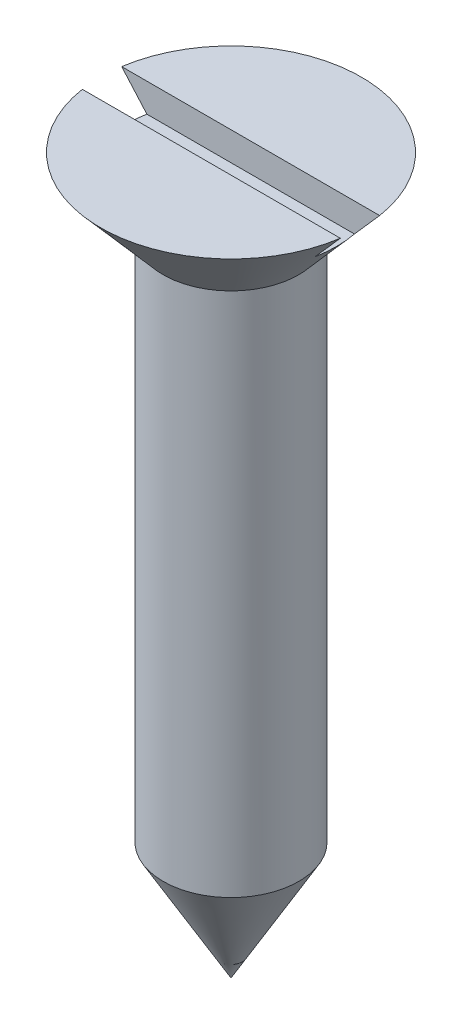
ISO-10303-21;
HEADER;
FILE_DESCRIPTION(('STEP AP214'),'2;1');
FILE_NAME('part.step','',(''),(''),'','','');
FILE_SCHEMA(('AUTOMOTIVE_DESIGN { 1 0 10303 214 1 1 1 1 }'));
ENDSEC;
DATA;
#1=APPLICATION_CONTEXT('core data for automotive mechanical design processes');
#2=APPLICATION_PROTOCOL_DEFINITION('international standard','automotive_design',2000,#1);
#3=PRODUCT_CONTEXT('',#1,'mechanical');
#4=PRODUCT('Part','Part','',(#3));
#5=PRODUCT_RELATED_PRODUCT_CATEGORY('part','',(#4));
#6=PRODUCT_DEFINITION_FORMATION('','',#4);
#7=PRODUCT_DEFINITION_CONTEXT('part definition',#1,'design');
#8=PRODUCT_DEFINITION('design','',#6,#7);
#9=PRODUCT_DEFINITION_SHAPE('','',#8);
#10=(LENGTH_UNIT() NAMED_UNIT(*) SI_UNIT(.MILLI.,.METRE.));
#11=(NAMED_UNIT(*) PLANE_ANGLE_UNIT() SI_UNIT($,.RADIAN.));
#12=(NAMED_UNIT(*) SI_UNIT($,.STERADIAN.) SOLID_ANGLE_UNIT());
#13=UNCERTAINTY_MEASURE_WITH_UNIT(LENGTH_MEASURE(1.E-05),#10,'distance_accuracy_value','');
#14=(GEOMETRIC_REPRESENTATION_CONTEXT(3) GLOBAL_UNCERTAINTY_ASSIGNED_CONTEXT((#13)) GLOBAL_UNIT_ASSIGNED_CONTEXT((#10,
#11,#12)) REPRESENTATION_CONTEXT('',''));
#15=CARTESIAN_POINT('',(0.,0.,0.));
#16=DIRECTION('',(0.,0.,1.));
#17=DIRECTION('',(1.,0.,0.));
#18=AXIS2_PLACEMENT_3D('',#15,#16,#17);
#19=CARTESIAN_POINT('',(0.,25.4,0.));
#20=DIRECTION('',(0.,1.,0.));
#21=DIRECTION('',(0.,0.,1.));
#22=AXIS2_PLACEMENT_3D('',#19,#20,#21);
#23=PLANE('',#22);
#24=DIRECTION('',(1.,0.,0.));
#25=VECTOR('',#24,1.);
#26=CARTESIAN_POINT('',(0.,25.4,0.6985));
#27=LINE('',#26,#25);
#28=CARTESIAN_POINT('',(-4.58257111237785,25.4,0.6985));
#29=VERTEX_POINT('',#28);
#30=CARTESIAN_POINT('',(4.58257111237785,25.4,0.6985));
#31=VERTEX_POINT('',#30);
#32=EDGE_CURVE('E94',#29,#31,#27,.T.);
#33=ORIENTED_EDGE('',*,*,#32,.F.);
#34=CARTESIAN_POINT('',(0.,25.4,0.));
#35=DIRECTION('',(0.,-1.,0.));
#36=DIRECTION('',(1.,0.,0.));
#37=AXIS2_PLACEMENT_3D('',#34,#35,#36);
#38=CIRCLE('',#37,4.6355);
#39=EDGE_CURVE('E108',#31,#29,#38,.T.);
#40=ORIENTED_EDGE('',*,*,#39,.F.);
#41=EDGE_LOOP('',(#33,#40));
#42=FACE_BOUND('',#41,.T.);
#43=ADVANCED_FACE('F46',(#42),#23,.T.);
#44=CARTESIAN_POINT('',(0.,25.4,0.));
#45=DIRECTION('',(0.,-1.,0.));
#46=DIRECTION('',(0.,0.,-1.));
#47=AXIS2_PLACEMENT_3D('',#44,#45,#46);
#48=CYLINDRICAL_SURFACE('',#47,2.413);
#49=CARTESIAN_POINT('',(0.,22.8433062149513,0.));
#50=DIRECTION('',(0.,1.,0.));
#51=DIRECTION('',(-1.,0.,0.));
#52=AXIS2_PLACEMENT_3D('',#49,#50,#51);
#53=CIRCLE('',#52,2.413);
#54=CARTESIAN_POINT('',(-2.413,22.8433062149513,0.));
#55=VERTEX_POINT('',#54);
#56=EDGE_CURVE('E95',#55,#55,#53,.F.);
#57=ORIENTED_EDGE('',*,*,#56,.T.);
#58=EDGE_LOOP('',(#57));
#59=FACE_BOUND('',#58,.T.);
#60=CARTESIAN_POINT('',(0.,4.17943859866376,0.));
#61=DIRECTION('',(0.,1.,0.));
#62=DIRECTION('',(0.,0.,1.));
#63=AXIS2_PLACEMENT_3D('',#60,#61,#62);
#64=CIRCLE('',#63,2.413);
#65=CARTESIAN_POINT('',(0.,4.17943859866376,2.413));
#66=VERTEX_POINT('',#65);
#67=EDGE_CURVE('E109',#66,#66,#64,.T.);
#68=ORIENTED_EDGE('',*,*,#67,.T.);
#69=EDGE_LOOP('',(#68));
#70=FACE_BOUND('',#69,.T.);
#71=ADVANCED_FACE('F48',(#59,#70),#48,.T.);
#72=CARTESIAN_POINT('',(0.,20.0674672483269,0.));
#73=DIRECTION('',(0.,1.,0.));
#74=DIRECTION('',(-1.,0.,0.));
#75=AXIS2_PLACEMENT_3D('',#72,#73,#74);
#76=CONICAL_SURFACE('',#75,0.,0.715584993317669);
#77=CARTESIAN_POINT('',(12.7239228215762,34.7267050796105,0.6985));
#78=CARTESIAN_POINT('',(12.3001572509421,34.2399567929915,0.6985));
#79=CARTESIAN_POINT('',(11.8763604578222,33.7532356733004,0.6985));
#80=CARTESIAN_POINT('',(11.028664891162,32.7798790859785,0.6985));
#81=CARTESIAN_POINT('',(10.6047661172503,32.2932436186712,0.6985));
#82=CARTESIAN_POINT('',(9.75675302797358,31.3200047015358,0.6985));
#83=CARTESIAN_POINT('',(9.33263868742159,30.8334012736527,0.6985));
#84=CARTESIAN_POINT('',(8.48420562839707,29.8603756240636,0.6985));
#85=CARTESIAN_POINT('',(8.05988691065418,29.3739534017216,0.6985));
#86=CARTESIAN_POINT('',(7.2164398972194,28.4077138051512,0.6985));
#87=CARTESIAN_POINT('',(6.79731581568072,27.9278927523368,0.6985));
#88=CARTESIAN_POINT('',(5.95853426298975,26.9687079309938,0.6985));
#89=CARTESIAN_POINT('',(5.53887678636059,26.4893441672504,0.6985));
#90=CARTESIAN_POINT('',(4.90864472636623,25.7710111396983,0.6985));
#91=CARTESIAN_POINT('',(4.69845756911359,25.5317020261792,0.6985));
#92=CARTESIAN_POINT('',(4.27769572212292,25.0534248115906,0.6985));
#93=CARTESIAN_POINT('',(4.06712103270087,24.8144567102434,0.6985));
#94=CARTESIAN_POINT('',(3.64537119919808,24.337058128522,0.6985));
#95=CARTESIAN_POINT('',(3.43419606529339,24.098627639158,0.6985));
#96=CARTESIAN_POINT('',(3.01084873187954,23.6226538951711,0.6985));
#97=CARTESIAN_POINT('',(2.79867654000073,23.3851106337833,0.6985));
#98=CARTESIAN_POINT('',(2.52960029103581,23.0862972349534,0.6985));
#99=CARTESIAN_POINT('',(2.47358661504908,23.0242256625782,0.6985));
#100=CARTESIAN_POINT('',(2.36139296082815,22.9002327427108,0.6985));
#101=CARTESIAN_POINT('',(2.3052129822708,22.8383113955107,0.6985));
#102=CARTESIAN_POINT('',(2.13635225908666,22.6527988956865,0.6985));
#103=CARTESIAN_POINT('',(2.02337060257298,22.5294814069046,0.6985));
#104=CARTESIAN_POINT('',(1.79574198127609,22.2835404232173,0.6985));
#105=CARTESIAN_POINT('',(1.68109041146271,22.1609211651908,0.6985));
#106=CARTESIAN_POINT('',(1.50750068681165,21.9785742781316,0.6985));
#107=CARTESIAN_POINT('',(1.44938125202166,21.9180683523884,0.6985));
#108=CARTESIAN_POINT('',(1.33238722051913,21.7977922352813,0.6985));
#109=CARTESIAN_POINT('',(1.27351264915804,21.7380220193495,0.6985));
#110=CARTESIAN_POINT('',(1.15488046951291,21.6197311388378,0.6985));
#111=CARTESIAN_POINT('',(1.09512614368296,21.5612071896787,0.6985));
#112=CARTESIAN_POINT('',(0.973994870008162,21.4457046252388,0.6985));
#113=CARTESIAN_POINT('',(0.912616182481289,21.3887278111057,0.6985));
#114=CARTESIAN_POINT('',(0.81877353349086,21.305332856265,0.6985));
#115=CARTESIAN_POINT('',(0.787217167328218,21.2778960935855,0.6985));
#116=CARTESIAN_POINT('',(0.723332736964162,21.223939226275,0.6985));
#117=CARTESIAN_POINT('',(0.691004772567425,21.1974190041661,0.6985));
#118=CARTESIAN_POINT('',(0.62541233269113,21.1456724443172,0.6985));
#119=CARTESIAN_POINT('',(0.592149556102306,21.1204439682204,0.6985));
#120=CARTESIAN_POINT('',(0.524362542232251,21.0717559037804,0.6985));
#121=CARTESIAN_POINT('',(0.489838953423334,21.0482954246095,0.6985));
#122=CARTESIAN_POINT('',(0.42993634247015,21.0107179276523,0.6985));
#123=CARTESIAN_POINT('',(0.404981585053334,20.9959343161633,0.6985));
#124=CARTESIAN_POINT('',(0.354168078423249,20.9680198218978,0.6985));
#125=CARTESIAN_POINT('',(0.328309003136598,20.9548895432869,0.6985));
#126=CARTESIAN_POINT('',(0.249541962976166,20.9189531994752,0.6985));
#127=CARTESIAN_POINT('',(0.195013627804839,20.8993108243763,0.6985));
#128=CARTESIAN_POINT('',(0.102859532567764,20.8786540032705,0.6985));
#129=CARTESIAN_POINT('',(0.0661918503363947,20.873483977899,0.6985));
#130=CARTESIAN_POINT('',(-0.00749446603889207,20.8699331183629,0.6985));
#131=CARTESIAN_POINT('',(-0.0445130627158178,20.8715515673632,0.6985));
#132=CARTESIAN_POINT('',(-0.117443117650927,20.8812111194696,0.6985));
#133=CARTESIAN_POINT('',(-0.153359548949532,20.8892168159622,0.6985));
#134=CARTESIAN_POINT('',(-0.223673805090342,20.9102825299731,0.6985));
#135=CARTESIAN_POINT('',(-0.258068979881605,20.9233510082475,0.6985));
#136=CARTESIAN_POINT('',(-0.337845909296758,20.958698372987,0.6985));
#137=CARTESIAN_POINT('',(-0.382493346961337,20.9825926947748,0.6985));
#138=CARTESIAN_POINT('',(-0.469309381305233,21.0345838888426,0.6985));
#139=CARTESIAN_POINT('',(-0.511471761563947,21.06269072484,0.6985));
#140=CARTESIAN_POINT('',(-0.594249640056022,21.1217821729535,0.6985));
#141=CARTESIAN_POINT('',(-0.634848796846465,21.1527893706913,0.6985));
#142=CARTESIAN_POINT('',(-0.714582801882151,21.2165191107183,0.6985));
#143=CARTESIAN_POINT('',(-0.753719291243177,21.2492396252044,0.6985));
#144=CARTESIAN_POINT('',(-0.835525773200393,21.3198319117915,0.6985));
#145=CARTESIAN_POINT('',(-0.878064805214522,21.3578545855141,0.6985));
#146=CARTESIAN_POINT('',(-0.962191267312984,21.4349416793109,0.6985));
#147=CARTESIAN_POINT('',(-1.00377858362059,21.4740062227433,0.6985));
#148=CARTESIAN_POINT('',(-1.12751779421424,21.5923331151308,0.6985));
#149=CARTESIAN_POINT('',(-1.20861242142419,21.6726979874991,0.6985));
#150=CARTESIAN_POINT('',(-1.36926043924451,21.835197810918,0.6985));
#151=CARTESIAN_POINT('',(-1.44881105894337,21.9173354697023,0.6985));
#152=CARTESIAN_POINT('',(-1.60680399965915,22.0826301430576,0.6985));
#153=CARTESIAN_POINT('',(-1.68524658609646,22.1657869042816,0.6985));
#154=CARTESIAN_POINT('',(-1.84105486552681,22.3324285213075,0.6985));
#155=CARTESIAN_POINT('',(-1.91842374830404,22.4159104038165,0.6985));
#156=CARTESIAN_POINT('',(-2.07264424422737,22.583359687323,0.6985));
#157=CARTESIAN_POINT('',(-2.14949582502329,22.6673271180856,0.6985));
#158=CARTESIAN_POINT('',(-2.30274294913753,22.8355324531096,0.6985));
#159=CARTESIAN_POINT('',(-2.37913885304024,22.9197700291863,0.6985));
#160=CARTESIAN_POINT('',(-2.5316379309869,23.0885063911909,0.6985));
#161=CARTESIAN_POINT('',(-2.60774111109111,23.1730051716451,0.6985));
#162=CARTESIAN_POINT('',(-2.83524944043004,23.4262812671099,0.6985));
#163=CARTESIAN_POINT('',(-2.98632334759558,23.5953560359498,0.6985));
#164=CARTESIAN_POINT('',(-3.28790976185461,23.9340057477974,0.6985));
#165=CARTESIAN_POINT('',(-3.43842226715179,24.1035806924025,0.6985));
#166=CARTESIAN_POINT('',(-3.88940429195349,24.6128067119152,0.6985));
#167=CARTESIAN_POINT('',(-4.18931362033144,24.9529537122861,0.6985));
#168=CARTESIAN_POINT('',(-4.78848300352906,25.6340410832952,0.6985));
#169=CARTESIAN_POINT('',(-5.08774277725742,25.9749817007914,0.6985));
#170=CARTESIAN_POINT('',(-5.68580423403468,26.6572601749773,0.6985));
#171=CARTESIAN_POINT('',(-5.98460592033756,26.9985980288147,0.6985));
#172=CARTESIAN_POINT('',(-6.58212446863885,27.6817577229065,0.6985));
#173=CARTESIAN_POINT('',(-6.88084113472869,28.0235797344397,0.6985));
#174=CARTESIAN_POINT('',(-7.47807903093902,28.7073955715385,0.6985));
#175=CARTESIAN_POINT('',(-7.77660026069037,29.0493893974266,0.6985));
#176=CARTESIAN_POINT('',(-8.67190206860297,30.0754810716289,0.6985));
#177=CARTESIAN_POINT('',(-9.26847941809688,30.7597562299949,0.6985));
#178=CARTESIAN_POINT('',(-10.1032855644837,31.7176960435832,0.6985));
#179=CARTESIAN_POINT('',(-10.341638063665,31.9912529385894,0.6985));
#180=CARTESIAN_POINT('',(-10.8183081974682,32.5384075301568,0.6985));
#181=CARTESIAN_POINT('',(-11.0566258312231,32.8120052274736,0.6985));
#182=CARTESIAN_POINT('',(-11.533124745263,33.3591094482981,0.6985));
#183=CARTESIAN_POINT('',(-11.7713060396737,33.6326159595039,0.6985));
#184=CARTESIAN_POINT('',(-12.2476361926467,34.1796467893632,0.6985));
#185=CARTESIAN_POINT('',(-12.4857850518009,34.4531711075013,0.6985));
#186=CARTESIAN_POINT('',(-12.7239228215762,34.7267050796105,0.6985));
#187=B_SPLINE_CURVE_WITH_KNOTS('',3,(#77,#78,#79,#80,#81,#82,#83,#84,#85,#86,#87,#88,#89,#90,
#91,#92,#93,#94,#95,#96,#97,#98,#99,#100,#101,#102,#103,#104,#105,#106,#107,#108,#109,#110,#111,
#112,#113,#114,#115,#116,#117,#118,#119,#120,#121,#122,#123,#124,#125,#126,#127,#128,#129,#130,
#131,#132,#133,#134,#135,#136,#137,#138,#139,#140,#141,#142,#143,#144,#145,#146,#147,#148,#149,
#150,#151,#152,#153,#154,#155,#156,#157,#158,#159,#160,#161,#162,#163,#164,#165,#166,#167,#168,
#169,#170,#171,#172,#173,#174,#175,#176,#177,#178,#179,#180,#181,#182,#183,#184,#185,#186),
.UNSPECIFIED.,.F.,.F.,(4,2,2,2,2,2,2,2,2,2,2,2,2,2,2,2,2,2,2,2,2,2,2,2,2,2,2,2,2,2,2,2,2,2,2,2,
2,2,2,2,2,2,2,2,2,2,2,2,2,2,2,2,2,2,4),(0.,1.93610703396337,3.87222122797828,5.80868778183579,
7.74514747281887,9.65643989316121,11.5677520996606,12.5232765769617,13.4788002755499,
14.4343078757766,15.3898081755046,15.6406339771219,15.8914602664638,16.3932020613794,
16.8967943256568,17.148483397082,17.4001640407986,17.6510686611942,17.9022538399664,
18.0276896509003,18.1531093239639,18.2783141788675,18.4034555199563,18.490409847424,
18.5773958583438,18.7498208611675,18.8603574113849,18.9708822896899,19.0807987138586,
19.190899624726,19.3424178487973,19.4943002810342,19.6474835460642,19.8004894373383,
19.9716296266773,20.1427901699016,20.4852498455253,20.8282759218774,21.1712183859411,
21.5126780217799,21.8541588164886,22.1953188217533,22.5364717255509,23.2166799578197,
23.8968903646731,25.2573323404717,26.618277371381,27.9792126897507,29.3410736162867,
30.702937107611,33.426396696939,34.5148853756526,35.6033976354746,36.6914349798751,
37.7794487121094),.UNSPECIFIED.);
#188=CARTESIAN_POINT('',(-3.68671779763036,24.384,0.6985));
#189=VERTEX_POINT('',#188);
#190=EDGE_CURVE('E104',#189,#29,#187,.T.);
#191=ORIENTED_EDGE('',*,*,#190,.F.);
#192=CARTESIAN_POINT('',(0.,24.384,0.));
#193=DIRECTION('',(0.,-1.,0.));
#194=DIRECTION('',(0.,0.,-1.));
#195=AXIS2_PLACEMENT_3D('',#192,#193,#194);
#196=CIRCLE('',#195,3.75230467437872);
#197=CARTESIAN_POINT('',(-3.68671779763036,24.384,-0.6985));
#198=VERTEX_POINT('',#197);
#199=EDGE_CURVE('E12',#198,#189,#196,.F.);
#200=ORIENTED_EDGE('',*,*,#199,.F.);
#201=CARTESIAN_POINT('',(-12.7239228215762,34.7267050796105,-0.6985));
#202=CARTESIAN_POINT('',(-12.3001572509421,34.2399567929915,-0.6985));
#203=CARTESIAN_POINT('',(-11.8763604578222,33.7532356733004,-0.6985));
#204=CARTESIAN_POINT('',(-11.028664891162,32.7798790859785,-0.6985));
#205=CARTESIAN_POINT('',(-10.6047661172503,32.2932436186712,-0.6985));
#206=CARTESIAN_POINT('',(-9.75675302797359,31.3200047015358,-0.6985));
#207=CARTESIAN_POINT('',(-9.33263868742161,30.8334012736527,-0.6985));
#208=CARTESIAN_POINT('',(-8.48420562839709,29.8603756240637,-0.6985));
#209=CARTESIAN_POINT('',(-8.0598869106542,29.3739534017216,-0.6985));
#210=CARTESIAN_POINT('',(-7.21643989721942,28.4077138051512,-0.6985));
#211=CARTESIAN_POINT('',(-6.79731581568074,27.9278927523369,-0.6985));
#212=CARTESIAN_POINT('',(-5.95853426298976,26.9687079309938,-0.6985));
#213=CARTESIAN_POINT('',(-5.53887678636061,26.4893441672505,-0.6985));
#214=CARTESIAN_POINT('',(-4.90864472636624,25.7710111396983,-0.6985));
#215=CARTESIAN_POINT('',(-4.6984575691136,25.5317020261792,-0.6985));
#216=CARTESIAN_POINT('',(-4.27769572212293,25.0534248115906,-0.6985));
#217=CARTESIAN_POINT('',(-4.06712103270088,24.8144567102434,-0.6985));
#218=CARTESIAN_POINT('',(-3.64537119919809,24.337058128522,-0.6985));
#219=CARTESIAN_POINT('',(-3.43419606529339,24.098627639158,-0.6985));
#220=CARTESIAN_POINT('',(-3.01084873187954,23.6226538951711,-0.6985));
#221=CARTESIAN_POINT('',(-2.79867654000073,23.3851106337833,-0.6985));
#222=CARTESIAN_POINT('',(-2.52960029103581,23.0862972349534,-0.6985));
#223=CARTESIAN_POINT('',(-2.47358661504908,23.0242256625783,-0.6985));
#224=CARTESIAN_POINT('',(-2.36139296082815,22.9002327427108,-0.6985));
#225=CARTESIAN_POINT('',(-2.3052129822708,22.8383113955107,-0.6985));
#226=CARTESIAN_POINT('',(-2.13635225908666,22.6527988956865,-0.6985));
#227=CARTESIAN_POINT('',(-2.02337060257298,22.5294814069046,-0.6985));
#228=CARTESIAN_POINT('',(-1.79574198127609,22.2835404232173,-0.6985));
#229=CARTESIAN_POINT('',(-1.68109041146272,22.1609211651908,-0.6985));
#230=CARTESIAN_POINT('',(-1.50750068681166,21.9785742781316,-0.6985));
#231=CARTESIAN_POINT('',(-1.44938125202167,21.9180683523884,-0.6985));
#232=CARTESIAN_POINT('',(-1.33238722051913,21.7977922352813,-0.6985));
#233=CARTESIAN_POINT('',(-1.27351264915804,21.7380220193495,-0.6985));
#234=CARTESIAN_POINT('',(-1.15488046951292,21.6197311388378,-0.6985));
#235=CARTESIAN_POINT('',(-1.09512614368296,21.5612071896787,-0.6985));
#236=CARTESIAN_POINT('',(-0.973994870008168,21.4457046252388,-0.6985));
#237=CARTESIAN_POINT('',(-0.912616182481293,21.3887278111057,-0.6985));
#238=CARTESIAN_POINT('',(-0.818773533490864,21.305332856265,-0.6985));
#239=CARTESIAN_POINT('',(-0.787217167328222,21.2778960935855,-0.6985));
#240=CARTESIAN_POINT('',(-0.723332736964167,21.223939226275,-0.6985));
#241=CARTESIAN_POINT('',(-0.691004772567429,21.1974190041661,-0.6985));
#242=CARTESIAN_POINT('',(-0.625412332691136,21.1456724443172,-0.6985));
#243=CARTESIAN_POINT('',(-0.592149556102312,21.1204439682204,-0.6985));
#244=CARTESIAN_POINT('',(-0.524362542232257,21.0717559037804,-0.6985));
#245=CARTESIAN_POINT('',(-0.489838953423338,21.0482954246095,-0.6985));
#246=CARTESIAN_POINT('',(-0.429936342470154,21.0107179276523,-0.6985));
#247=CARTESIAN_POINT('',(-0.404981585053339,20.9959343161633,-0.6985));
#248=CARTESIAN_POINT('',(-0.354168078423252,20.9680198218978,-0.6985));
#249=CARTESIAN_POINT('',(-0.3283090031366,20.9548895432869,-0.6985));
#250=CARTESIAN_POINT('',(-0.249541962976169,20.9189531994752,-0.6985));
#251=CARTESIAN_POINT('',(-0.195013627804845,20.8993108243763,-0.6985));
#252=CARTESIAN_POINT('',(-0.102859532567772,20.8786540032705,-0.6985));
#253=CARTESIAN_POINT('',(-0.0661918503364016,20.873483977899,-0.6985));
#254=CARTESIAN_POINT('',(0.00749446603888481,20.8699331183629,-0.6985));
#255=CARTESIAN_POINT('',(0.0445130627158097,20.8715515673632,-0.6985));
#256=CARTESIAN_POINT('',(0.117443117650918,20.8812111194696,-0.6985));
#257=CARTESIAN_POINT('',(0.153359548949523,20.8892168159622,-0.6985));
#258=CARTESIAN_POINT('',(0.223673805090333,20.9102825299731,-0.6985));
#259=CARTESIAN_POINT('',(0.258068979881595,20.9233510082475,-0.6985));
#260=CARTESIAN_POINT('',(0.337845909296746,20.958698372987,-0.6985));
#261=CARTESIAN_POINT('',(0.382493346961323,20.9825926947747,-0.6985));
#262=CARTESIAN_POINT('',(0.469309381305215,21.0345838888426,-0.6985));
#263=CARTESIAN_POINT('',(0.511471761563927,21.06269072484,-0.6985));
#264=CARTESIAN_POINT('',(0.594249640055999,21.1217821729535,-0.6985));
#265=CARTESIAN_POINT('',(0.63484879684644,21.1527893706913,-0.6985));
#266=CARTESIAN_POINT('',(0.714582801882123,21.2165191107183,-0.6985));
#267=CARTESIAN_POINT('',(0.753719291243147,21.2492396252044,-0.6985));
#268=CARTESIAN_POINT('',(0.835525773200359,21.3198319117914,-0.6985));
#269=CARTESIAN_POINT('',(0.878064805214486,21.357854585514,-0.6985));
#270=CARTESIAN_POINT('',(0.962191267312945,21.4349416793108,-0.6985));
#271=CARTESIAN_POINT('',(1.00377858362055,21.4740062227433,-0.6985));
#272=CARTESIAN_POINT('',(1.12751779421419,21.5923331151308,-0.6985));
#273=CARTESIAN_POINT('',(1.20861242142414,21.672697987499,-0.6985));
#274=CARTESIAN_POINT('',(1.36926043924445,21.835197810918,-0.6985));
#275=CARTESIAN_POINT('',(1.4488110589433,21.9173354697022,-0.6985));
#276=CARTESIAN_POINT('',(1.60680399965908,22.0826301430575,-0.6985));
#277=CARTESIAN_POINT('',(1.68524658609639,22.1657869042815,-0.6985));
#278=CARTESIAN_POINT('',(1.84105486552672,22.3324285213074,-0.6985));
#279=CARTESIAN_POINT('',(1.91842374830395,22.4159104038164,-0.6985));
#280=CARTESIAN_POINT('',(2.07264424422727,22.5833596873229,-0.6985));
#281=CARTESIAN_POINT('',(2.14949582502319,22.6673271180855,-0.6985));
#282=CARTESIAN_POINT('',(2.30274294913742,22.8355324531095,-0.6985));
#283=CARTESIAN_POINT('',(2.37913885304012,22.9197700291862,-0.6985));
#284=CARTESIAN_POINT('',(2.53163793098677,23.0885063911908,-0.6985));
#285=CARTESIAN_POINT('',(2.60774111109098,23.173005171645,-0.6985));
#286=CARTESIAN_POINT('',(2.8352494404299,23.4262812671098,-0.6985));
#287=CARTESIAN_POINT('',(2.98632334759543,23.5953560359496,-0.6985));
#288=CARTESIAN_POINT('',(3.28790976185445,23.9340057477972,-0.6985));
#289=CARTESIAN_POINT('',(3.43842226715162,24.1035806924023,-0.6985));
#290=CARTESIAN_POINT('',(3.8894042919533,24.612806711915,-0.6985));
#291=CARTESIAN_POINT('',(4.18931362033123,24.9529537122858,-0.6985));
#292=CARTESIAN_POINT('',(4.78848300352881,25.6340410832949,-0.6985));
#293=CARTESIAN_POINT('',(5.08774277725716,25.9749817007911,-0.6985));
#294=CARTESIAN_POINT('',(5.68580423403439,26.657260174977,-0.6985));
#295=CARTESIAN_POINT('',(5.98460592033725,26.9985980288143,-0.6985));
#296=CARTESIAN_POINT('',(6.5821244686385,27.6817577229061,-0.6985));
#297=CARTESIAN_POINT('',(6.88084113472833,28.0235797344392,-0.6985));
#298=CARTESIAN_POINT('',(7.47807903093863,28.7073955715381,-0.6985));
#299=CARTESIAN_POINT('',(7.77660026068996,29.0493893974261,-0.6985));
#300=CARTESIAN_POINT('',(8.67190206860251,30.0754810716284,-0.6985));
#301=CARTESIAN_POINT('',(9.26847941809638,30.7597562299943,-0.6985));
#302=CARTESIAN_POINT('',(10.1032855644832,31.7176960435826,-0.6985));
#303=CARTESIAN_POINT('',(10.3416380636645,31.9912529385889,-0.6985));
#304=CARTESIAN_POINT('',(10.8183081974679,32.5384075301564,-0.6985));
#305=CARTESIAN_POINT('',(11.0566258312228,32.8120052274733,-0.6985));
#306=CARTESIAN_POINT('',(11.5331247452628,33.3591094482979,-0.6985));
#307=CARTESIAN_POINT('',(11.7713060396735,33.6326159595037,-0.6985));
#308=CARTESIAN_POINT('',(12.2476361926466,34.1796467893631,-0.6985));
#309=CARTESIAN_POINT('',(12.4857850518008,34.4531711075013,-0.6985));
#310=CARTESIAN_POINT('',(12.7239228215762,34.7267050796105,-0.6985));
#311=B_SPLINE_CURVE_WITH_KNOTS('',3,(#201,#202,#203,#204,#205,#206,#207,#208,#209,#210,#211,
#212,#213,#214,#215,#216,#217,#218,#219,#220,#221,#222,#223,#224,#225,#226,#227,#228,#229,#230,
#231,#232,#233,#234,#235,#236,#237,#238,#239,#240,#241,#242,#243,#244,#245,#246,#247,#248,#249,
#250,#251,#252,#253,#254,#255,#256,#257,#258,#259,#260,#261,#262,#263,#264,#265,#266,#267,#268,
#269,#270,#271,#272,#273,#274,#275,#276,#277,#278,#279,#280,#281,#282,#283,#284,#285,#286,#287,
#288,#289,#290,#291,#292,#293,#294,#295,#296,#297,#298,#299,#300,#301,#302,#303,#304,#305,#306,
#307,#308,#309,#310),.UNSPECIFIED.,.F.,.F.,(4,2,2,2,2,2,2,2,2,2,2,2,2,2,2,2,2,2,2,2,2,2,2,2,2,2,
2,2,2,2,2,2,2,2,2,2,2,2,2,2,2,2,2,2,2,2,2,2,2,2,2,2,2,2,4),(0.,1.93610703396337,
3.87222122797826,5.80868778183577,7.74514747281884,9.65643989316118,11.5677520996606,
12.5232765769617,13.4788002755499,14.4343078757766,15.3898081755046,15.6406339771218,
15.8914602664638,16.3932020613793,16.8967943256567,17.148483397082,17.4001640407986,
17.6510686611942,17.9022538399664,18.0276896509003,18.1531093239639,18.2783141788675,
18.4034555199563,18.490409847424,18.5773958583438,18.7498208611675,18.8603574113849,
18.9708822896899,19.0807987138586,19.190899624726,19.3424178487973,19.4943002810342,
19.6474835460641,19.8004894373383,19.9716296266772,20.1427901699015,20.4852498455252,
20.8282759218773,21.171218385941,21.5126780217798,21.8541588164885,22.1953188217531,
22.5364717255507,23.2166799578194,23.8968903646729,25.2573323404714,26.6182773713805,
27.9792126897502,29.3410736162861,30.7029371076104,33.4263966969382,34.514885375652,
35.6033976354742,36.6914349798748,37.7794487121094),.UNSPECIFIED.);
#312=CARTESIAN_POINT('',(-4.58257111237785,25.4,-0.6985));
#313=VERTEX_POINT('',#312);
#314=EDGE_CURVE('E88',#313,#198,#311,.T.);
#315=ORIENTED_EDGE('',*,*,#314,.F.);
#316=CARTESIAN_POINT('',(4.58257111237785,25.4,-0.6985));
#317=VERTEX_POINT('',#316);
#318=EDGE_CURVE('E102',#313,#317,#38,.T.);
#319=ORIENTED_EDGE('',*,*,#318,.T.);
#320=CARTESIAN_POINT('',(3.68671779763036,24.384,-0.6985));
#321=VERTEX_POINT('',#320);
#322=EDGE_CURVE('E62',#321,#317,#311,.T.);
#323=ORIENTED_EDGE('',*,*,#322,.F.);
#324=CARTESIAN_POINT('',(3.68671779763036,24.384,0.6985));
#325=VERTEX_POINT('',#324);
#326=EDGE_CURVE('E50',#325,#321,#196,.F.);
#327=ORIENTED_EDGE('',*,*,#326,.F.);
#328=EDGE_CURVE('E115',#31,#325,#187,.T.);
#329=ORIENTED_EDGE('',*,*,#328,.F.);
#330=ORIENTED_EDGE('',*,*,#39,.T.);
#331=EDGE_LOOP('',(#191,#200,#315,#319,#323,#327,#329,#330));
#332=FACE_BOUND('',#331,.T.);
#333=ORIENTED_EDGE('',*,*,#56,.F.);
#334=EDGE_LOOP('',(#333));
#335=FACE_BOUND('',#334,.T.);
#336=ADVANCED_FACE('F100',(#332,#335),#76,.T.);
#337=DIRECTION('',(-1.,0.,0.));
#338=VECTOR('',#337,1.);
#339=CARTESIAN_POINT('',(0.,25.4,-0.6985));
#340=LINE('',#339,#338);
#341=EDGE_CURVE('E85',#317,#313,#340,.T.);
#342=ORIENTED_EDGE('',*,*,#341,.F.);
#343=ORIENTED_EDGE('',*,*,#318,.F.);
#344=EDGE_LOOP('',(#342,#343));
#345=FACE_BOUND('',#344,.T.);
#346=ADVANCED_FACE('F106',(#345),#23,.T.);
#347=CARTESIAN_POINT('',(0.,4.17943859866376,0.));
#348=DIRECTION('',(0.,1.,0.));
#349=DIRECTION('',(0.,0.,1.));
#350=AXIS2_PLACEMENT_3D('',#347,#348,#349);
#351=CONICAL_SURFACE('',#350,2.413,0.523598775598293);
#352=CARTESIAN_POINT('',(0.,0.,0.));
#353=VERTEX_POINT('',#352);
#354=VERTEX_LOOP('',#353);
#355=FACE_BOUND('',#354,.T.);
#356=ORIENTED_EDGE('',*,*,#67,.F.);
#357=EDGE_LOOP('',(#356));
#358=FACE_BOUND('',#357,.T.);
#359=ADVANCED_FACE('F156',(#355,#358),#351,.T.);
#360=CARTESIAN_POINT('',(-5.9055,24.384,0.6985));
#361=DIRECTION('',(0.,0.,1.));
#362=DIRECTION('',(1.,0.,0.));
#363=AXIS2_PLACEMENT_3D('',#360,#361,#362);
#364=PLANE('',#363);
#365=ORIENTED_EDGE('',*,*,#328,.T.);
#366=DIRECTION('',(1.,0.,0.));
#367=VECTOR('',#366,1.);
#368=CARTESIAN_POINT('',(-5.9055,24.384,0.6985));
#369=LINE('',#368,#367);
#370=EDGE_CURVE('E132',#189,#325,#369,.T.);
#371=ORIENTED_EDGE('',*,*,#370,.F.);
#372=ORIENTED_EDGE('',*,*,#190,.T.);
#373=ORIENTED_EDGE('',*,*,#32,.T.);
#374=EDGE_LOOP('',(#365,#371,#372,#373));
#375=FACE_BOUND('',#374,.T.);
#376=ADVANCED_FACE('F153',(#375),#364,.F.);
#377=CARTESIAN_POINT('',(-5.9055,24.384,-0.6985));
#378=DIRECTION('',(0.,0.,-1.));
#379=DIRECTION('',(-1.,0.,0.));
#380=AXIS2_PLACEMENT_3D('',#377,#378,#379);
#381=PLANE('',#380);
#382=ORIENTED_EDGE('',*,*,#314,.T.);
#383=DIRECTION('',(-1.,0.,0.));
#384=VECTOR('',#383,1.);
#385=CARTESIAN_POINT('',(-5.9055,24.384,-0.6985));
#386=LINE('',#385,#384);
#387=EDGE_CURVE('E130',#321,#198,#386,.T.);
#388=ORIENTED_EDGE('',*,*,#387,.F.);
#389=ORIENTED_EDGE('',*,*,#322,.T.);
#390=ORIENTED_EDGE('',*,*,#341,.T.);
#391=EDGE_LOOP('',(#382,#388,#389,#390));
#392=FACE_BOUND('',#391,.T.);
#393=ADVANCED_FACE('F87',(#392),#381,.F.);
#394=CARTESIAN_POINT('',(0.,24.384,0.));
#395=DIRECTION('',(0.,-1.,0.));
#396=DIRECTION('',(0.,0.,-1.));
#397=AXIS2_PLACEMENT_3D('',#394,#395,#396);
#398=PLANE('',#397);
#399=ORIENTED_EDGE('',*,*,#199,.T.);
#400=ORIENTED_EDGE('',*,*,#370,.T.);
#401=ORIENTED_EDGE('',*,*,#326,.T.);
#402=ORIENTED_EDGE('',*,*,#387,.T.);
#403=EDGE_LOOP('',(#399,#400,#401,#402));
#404=FACE_BOUND('',#403,.T.);
#405=ADVANCED_FACE('F129',(#404),#398,.F.);
#406=CLOSED_SHELL('',(#43,#71,#336,#346,#359,#376,#393,#405));
#407=MANIFOLD_SOLID_BREP('B2',#406);
#408=ADVANCED_BREP_SHAPE_REPRESENTATION('',(#18,#407),#14);
#409=SHAPE_DEFINITION_REPRESENTATION(#9,#408);
ENDSEC;
END-ISO-10303-21;
